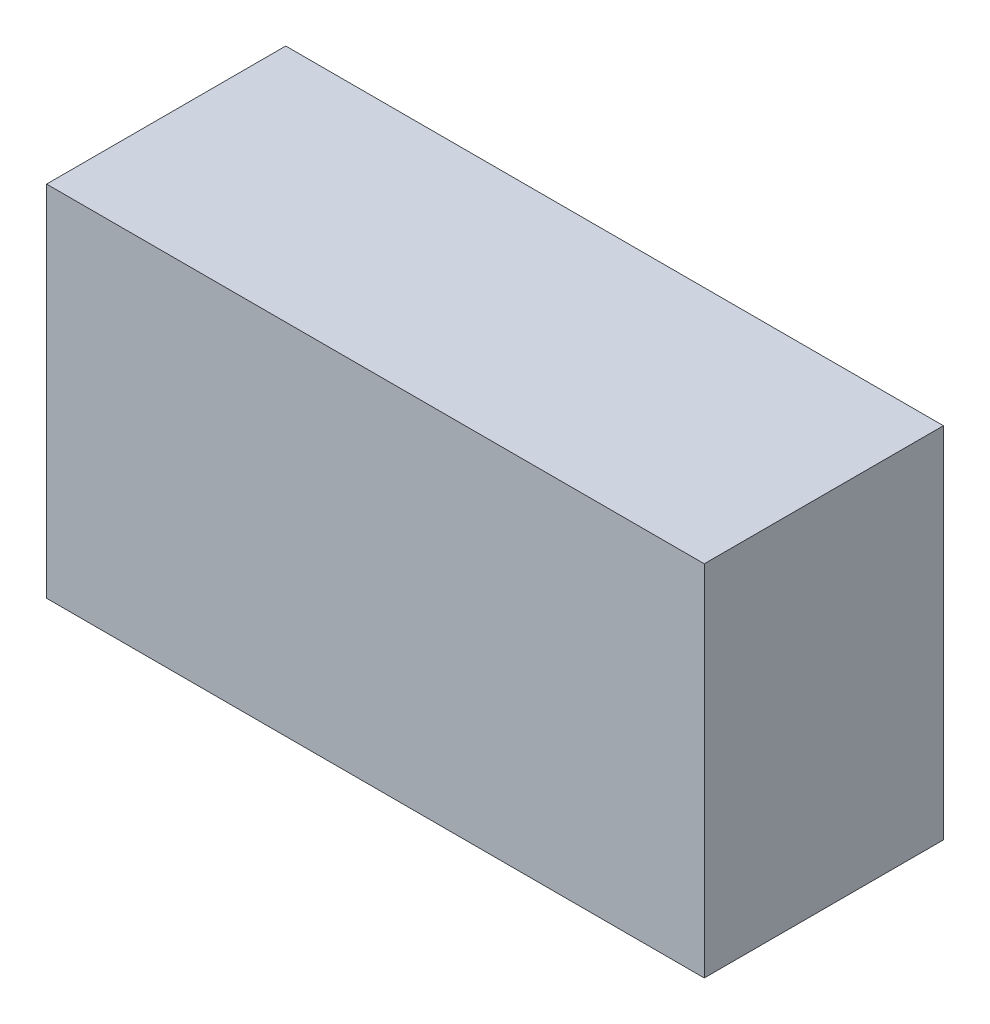
ISO-10303-21;
HEADER;
FILE_DESCRIPTION(('STEP AP214'),'2;1');
FILE_NAME('part.step','',(''),(''),'','','');
FILE_SCHEMA(('AUTOMOTIVE_DESIGN { 1 0 10303 214 1 1 1 1 }'));
ENDSEC;
DATA;
#1=APPLICATION_CONTEXT('core data for automotive mechanical design processes');
#2=APPLICATION_PROTOCOL_DEFINITION('international standard','automotive_design',2000,#1);
#3=PRODUCT_CONTEXT('',#1,'mechanical');
#4=PRODUCT('Part','Part','',(#3));
#5=PRODUCT_RELATED_PRODUCT_CATEGORY('part','',(#4));
#6=PRODUCT_DEFINITION_FORMATION('','',#4);
#7=PRODUCT_DEFINITION_CONTEXT('part definition',#1,'design');
#8=PRODUCT_DEFINITION('design','',#6,#7);
#9=PRODUCT_DEFINITION_SHAPE('','',#8);
#10=(LENGTH_UNIT() NAMED_UNIT(*) SI_UNIT(.MILLI.,.METRE.));
#11=(NAMED_UNIT(*) PLANE_ANGLE_UNIT() SI_UNIT($,.RADIAN.));
#12=(NAMED_UNIT(*) SI_UNIT($,.STERADIAN.) SOLID_ANGLE_UNIT());
#13=UNCERTAINTY_MEASURE_WITH_UNIT(LENGTH_MEASURE(1.E-05),#10,'distance_accuracy_value','');
#14=(GEOMETRIC_REPRESENTATION_CONTEXT(3) GLOBAL_UNCERTAINTY_ASSIGNED_CONTEXT((#13)) GLOBAL_UNIT_ASSIGNED_CONTEXT((#10,
#11,#12)) REPRESENTATION_CONTEXT('',''));
#15=CARTESIAN_POINT('',(0.,0.,0.));
#16=DIRECTION('',(0.,0.,1.));
#17=DIRECTION('',(1.,0.,0.));
#18=AXIS2_PLACEMENT_3D('',#15,#16,#17);
#19=CARTESIAN_POINT('',(0.,0.,12.));
#20=DIRECTION('',(1.,0.,0.));
#21=DIRECTION('',(0.,0.,-1.));
#22=AXIS2_PLACEMENT_3D('',#19,#20,#21);
#23=PLANE('',#22);
#24=DIRECTION('',(0.,-1.,0.));
#25=VECTOR('',#24,1.);
#26=CARTESIAN_POINT('',(0.,0.,0.));
#27=LINE('',#26,#25);
#28=CARTESIAN_POINT('',(0.,18.,0.));
#29=VERTEX_POINT('',#28);
#30=CARTESIAN_POINT('',(0.,0.,0.));
#31=VERTEX_POINT('',#30);
#32=EDGE_CURVE('E154',#29,#31,#27,.T.);
#33=ORIENTED_EDGE('',*,*,#32,.T.);
#34=DIRECTION('',(0.,0.,-1.));
#35=VECTOR('',#34,1.);
#36=CARTESIAN_POINT('',(0.,0.,12.));
#37=LINE('',#36,#35);
#38=CARTESIAN_POINT('',(0.,0.,12.));
#39=VERTEX_POINT('',#38);
#40=EDGE_CURVE('E11',#39,#31,#37,.T.);
#41=ORIENTED_EDGE('',*,*,#40,.F.);
#42=DIRECTION('',(0.,-1.,0.));
#43=VECTOR('',#42,1.);
#44=CARTESIAN_POINT('',(0.,0.,12.));
#45=LINE('',#44,#43);
#46=CARTESIAN_POINT('',(0.,18.,12.));
#47=VERTEX_POINT('',#46);
#48=EDGE_CURVE('E163',#47,#39,#45,.T.);
#49=ORIENTED_EDGE('',*,*,#48,.F.);
#50=DIRECTION('',(0.,0.,-1.));
#51=VECTOR('',#50,1.);
#52=CARTESIAN_POINT('',(0.,18.,12.));
#53=LINE('',#52,#51);
#54=EDGE_CURVE('E172',#47,#29,#53,.T.);
#55=ORIENTED_EDGE('',*,*,#54,.T.);
#56=EDGE_LOOP('',(#33,#41,#49,#55));
#57=FACE_BOUND('',#56,.T.);
#58=CARTESIAN_POINT('',(0.,5.81000000000001,2.70000000000003));
#59=DIRECTION('',(-1.,0.,0.));
#60=DIRECTION('',(0.,0.,1.));
#61=AXIS2_PLACEMENT_3D('',#58,#59,#60);
#62=CIRCLE('',#61,1.28);
#63=CARTESIAN_POINT('',(0.,5.81,1.42000000000003));
#64=VERTEX_POINT('',#63);
#65=CARTESIAN_POINT('',(0.,4.53,2.7));
#66=VERTEX_POINT('',#65);
#67=EDGE_CURVE('E153',#64,#66,#62,.T.);
#68=ORIENTED_EDGE('',*,*,#67,.F.);
#69=DIRECTION('',(0.,-1.,0.));
#70=VECTOR('',#69,1.);
#71=CARTESIAN_POINT('',(0.,12.19,1.42000000000003));
#72=LINE('',#71,#70);
#73=CARTESIAN_POINT('',(0.,12.19,1.42000000000003));
#74=VERTEX_POINT('',#73);
#75=EDGE_CURVE('E150',#74,#64,#72,.T.);
#76=ORIENTED_EDGE('',*,*,#75,.F.);
#77=CARTESIAN_POINT('',(0.,12.19,2.70000000000003));
#78=DIRECTION('',(-1.,0.,0.));
#79=DIRECTION('',(0.,0.,1.));
#80=AXIS2_PLACEMENT_3D('',#77,#78,#79);
#81=CIRCLE('',#80,1.28);
#82=CARTESIAN_POINT('',(0.,13.47,2.7));
#83=VERTEX_POINT('',#82);
#84=EDGE_CURVE('E340',#83,#74,#81,.T.);
#85=ORIENTED_EDGE('',*,*,#84,.F.);
#86=DIRECTION('',(0.,0.,-1.));
#87=VECTOR('',#86,1.);
#88=CARTESIAN_POINT('',(0.,13.47,3.30000000000001));
#89=LINE('',#88,#87);
#90=CARTESIAN_POINT('',(0.,13.47,3.30000000000001));
#91=VERTEX_POINT('',#90);
#92=EDGE_CURVE('E371',#91,#83,#89,.T.);
#93=ORIENTED_EDGE('',*,*,#92,.F.);
#94=CARTESIAN_POINT('',(0.,12.19,3.30000000000005));
#95=DIRECTION('',(-1.,0.,0.));
#96=DIRECTION('',(0.,0.,1.));
#97=AXIS2_PLACEMENT_3D('',#94,#95,#96);
#98=CIRCLE('',#97,1.28);
#99=CARTESIAN_POINT('',(0.,12.19,4.58000000000004));
#100=VERTEX_POINT('',#99);
#101=EDGE_CURVE('E364',#100,#91,#98,.T.);
#102=ORIENTED_EDGE('',*,*,#101,.F.);
#103=DIRECTION('',(0.,1.,0.));
#104=VECTOR('',#103,1.);
#105=CARTESIAN_POINT('',(0.,5.81,4.58000000000004));
#106=LINE('',#105,#104);
#107=CARTESIAN_POINT('',(0.,5.81,4.58000000000004));
#108=VERTEX_POINT('',#107);
#109=EDGE_CURVE('E361',#108,#100,#106,.T.);
#110=ORIENTED_EDGE('',*,*,#109,.F.);
#111=CARTESIAN_POINT('',(0.,5.81,3.30000000000004));
#112=DIRECTION('',(-1.,0.,0.));
#113=DIRECTION('',(0.,0.,1.));
#114=AXIS2_PLACEMENT_3D('',#111,#112,#113);
#115=CIRCLE('',#114,1.28);
#116=CARTESIAN_POINT('',(0.,4.53,3.3));
#117=VERTEX_POINT('',#116);
#118=EDGE_CURVE('E64',#117,#108,#115,.T.);
#119=ORIENTED_EDGE('',*,*,#118,.F.);
#120=DIRECTION('',(0.,0.,1.));
#121=VECTOR('',#120,1.);
#122=CARTESIAN_POINT('',(0.,4.53,2.7));
#123=LINE('',#122,#121);
#124=EDGE_CURVE('E59',#66,#117,#123,.T.);
#125=ORIENTED_EDGE('',*,*,#124,.F.);
#126=EDGE_LOOP('',(#68,#76,#85,#93,#102,#110,#119,#125));
#127=FACE_BOUND('',#126,.T.);
#128=ADVANCED_FACE('F45',(#57,#127),#23,.F.);
#129=CARTESIAN_POINT('',(0.,0.,12.));
#130=DIRECTION('',(0.,1.,0.));
#131=DIRECTION('',(0.,0.,1.));
#132=AXIS2_PLACEMENT_3D('',#129,#130,#131);
#133=PLANE('',#132);
#134=DIRECTION('',(1.,0.,0.));
#135=VECTOR('',#134,1.);
#136=CARTESIAN_POINT('',(0.,0.,0.));
#137=LINE('',#136,#135);
#138=CARTESIAN_POINT('',(33.,0.,0.));
#139=VERTEX_POINT('',#138);
#140=EDGE_CURVE('E157',#31,#139,#137,.T.);
#141=ORIENTED_EDGE('',*,*,#140,.T.);
#142=DIRECTION('',(0.,0.,-1.));
#143=VECTOR('',#142,1.);
#144=CARTESIAN_POINT('',(33.,0.,12.));
#145=LINE('',#144,#143);
#146=CARTESIAN_POINT('',(33.,0.,12.));
#147=VERTEX_POINT('',#146);
#148=EDGE_CURVE('E52',#147,#139,#145,.T.);
#149=ORIENTED_EDGE('',*,*,#148,.F.);
#150=DIRECTION('',(1.,0.,0.));
#151=VECTOR('',#150,1.);
#152=CARTESIAN_POINT('',(0.,0.,12.));
#153=LINE('',#152,#151);
#154=EDGE_CURVE('E166',#39,#147,#153,.T.);
#155=ORIENTED_EDGE('',*,*,#154,.F.);
#156=ORIENTED_EDGE('',*,*,#40,.T.);
#157=EDGE_LOOP('',(#141,#149,#155,#156));
#158=FACE_BOUND('',#157,.T.);
#159=ADVANCED_FACE('F203',(#158),#133,.F.);
#160=CARTESIAN_POINT('',(33.,0.,12.));
#161=DIRECTION('',(-1.,0.,0.));
#162=DIRECTION('',(0.,0.,1.));
#163=AXIS2_PLACEMENT_3D('',#160,#161,#162);
#164=PLANE('',#163);
#165=DIRECTION('',(0.,1.,0.));
#166=VECTOR('',#165,1.);
#167=CARTESIAN_POINT('',(33.,0.,0.));
#168=LINE('',#167,#166);
#169=CARTESIAN_POINT('',(33.,18.,0.));
#170=VERTEX_POINT('',#169);
#171=EDGE_CURVE('E175',#139,#170,#168,.T.);
#172=ORIENTED_EDGE('',*,*,#171,.T.);
#173=DIRECTION('',(0.,0.,-1.));
#174=VECTOR('',#173,1.);
#175=CARTESIAN_POINT('',(33.,18.,12.));
#176=LINE('',#175,#174);
#177=CARTESIAN_POINT('',(33.,18.,12.));
#178=VERTEX_POINT('',#177);
#179=EDGE_CURVE('E180',#178,#170,#176,.T.);
#180=ORIENTED_EDGE('',*,*,#179,.F.);
#181=DIRECTION('',(0.,1.,0.));
#182=VECTOR('',#181,1.);
#183=CARTESIAN_POINT('',(33.,0.,12.));
#184=LINE('',#183,#182);
#185=EDGE_CURVE('E169',#147,#178,#184,.T.);
#186=ORIENTED_EDGE('',*,*,#185,.F.);
#187=ORIENTED_EDGE('',*,*,#148,.T.);
#188=EDGE_LOOP('',(#172,#180,#186,#187));
#189=FACE_BOUND('',#188,.T.);
#190=ADVANCED_FACE('F187',(#189),#164,.F.);
#191=CARTESIAN_POINT('',(0.,18.,12.));
#192=DIRECTION('',(0.,-1.,0.));
#193=DIRECTION('',(0.,0.,-1.));
#194=AXIS2_PLACEMENT_3D('',#191,#192,#193);
#195=PLANE('',#194);
#196=DIRECTION('',(-1.,0.,0.));
#197=VECTOR('',#196,1.);
#198=CARTESIAN_POINT('',(0.,18.,0.));
#199=LINE('',#198,#197);
#200=EDGE_CURVE('E167',#170,#29,#199,.T.);
#201=ORIENTED_EDGE('',*,*,#200,.T.);
#202=ORIENTED_EDGE('',*,*,#54,.F.);
#203=DIRECTION('',(-1.,0.,0.));
#204=VECTOR('',#203,1.);
#205=CARTESIAN_POINT('',(0.,18.,12.));
#206=LINE('',#205,#204);
#207=EDGE_CURVE('E171',#178,#47,#206,.T.);
#208=ORIENTED_EDGE('',*,*,#207,.F.);
#209=ORIENTED_EDGE('',*,*,#179,.T.);
#210=EDGE_LOOP('',(#201,#202,#208,#209));
#211=FACE_BOUND('',#210,.T.);
#212=ADVANCED_FACE('F196',(#211),#195,.F.);
#213=CARTESIAN_POINT('',(0.,0.,12.));
#214=DIRECTION('',(0.,0.,-1.));
#215=DIRECTION('',(-1.,0.,0.));
#216=AXIS2_PLACEMENT_3D('',#213,#214,#215);
#217=PLANE('',#216);
#218=ORIENTED_EDGE('',*,*,#48,.T.);
#219=ORIENTED_EDGE('',*,*,#154,.T.);
#220=ORIENTED_EDGE('',*,*,#185,.T.);
#221=ORIENTED_EDGE('',*,*,#207,.T.);
#222=EDGE_LOOP('',(#218,#219,#220,#221));
#223=FACE_BOUND('',#222,.T.);
#224=ADVANCED_FACE('F202',(#223),#217,.F.);
#225=CARTESIAN_POINT('',(0.,0.,0.));
#226=DIRECTION('',(0.,0.,-1.));
#227=DIRECTION('',(-1.,0.,0.));
#228=AXIS2_PLACEMENT_3D('',#225,#226,#227);
#229=PLANE('',#228);
#230=ORIENTED_EDGE('',*,*,#32,.F.);
#231=ORIENTED_EDGE('',*,*,#200,.F.);
#232=ORIENTED_EDGE('',*,*,#171,.F.);
#233=ORIENTED_EDGE('',*,*,#140,.F.);
#234=EDGE_LOOP('',(#230,#231,#232,#233));
#235=FACE_BOUND('',#234,.T.);
#236=ADVANCED_FACE('F193',(#235),#229,.T.);
#237=CARTESIAN_POINT('',(-2.,5.81000000000001,2.70000000000003));
#238=DIRECTION('',(1.,0.,0.));
#239=DIRECTION('',(0.,0.,-1.));
#240=AXIS2_PLACEMENT_3D('',#237,#238,#239);
#241=CYLINDRICAL_SURFACE('',#240,1.28);
#242=ORIENTED_EDGE('',*,*,#67,.T.);
#243=DIRECTION('',(1.,0.,0.));
#244=VECTOR('',#243,1.);
#245=CARTESIAN_POINT('',(-2.,4.53,2.7));
#246=LINE('',#245,#244);
#247=CARTESIAN_POINT('',(-2.,4.53,2.7));
#248=VERTEX_POINT('',#247);
#249=EDGE_CURVE('E134',#248,#66,#246,.T.);
#250=ORIENTED_EDGE('',*,*,#249,.F.);
#251=CARTESIAN_POINT('',(-2.,5.81000000000001,2.70000000000003));
#252=DIRECTION('',(-1.,0.,0.));
#253=DIRECTION('',(0.,0.,1.));
#254=AXIS2_PLACEMENT_3D('',#251,#252,#253);
#255=CIRCLE('',#254,1.28);
#256=CARTESIAN_POINT('',(-2.,5.81,1.42000000000003));
#257=VERTEX_POINT('',#256);
#258=EDGE_CURVE('E141',#257,#248,#255,.T.);
#259=ORIENTED_EDGE('',*,*,#258,.F.);
#260=DIRECTION('',(1.,0.,0.));
#261=VECTOR('',#260,1.);
#262=CARTESIAN_POINT('',(-2.,5.81,1.42000000000003));
#263=LINE('',#262,#261);
#264=EDGE_CURVE('E336',#257,#64,#263,.T.);
#265=ORIENTED_EDGE('',*,*,#264,.T.);
#266=EDGE_LOOP('',(#242,#250,#259,#265));
#267=FACE_BOUND('',#266,.T.);
#268=ADVANCED_FACE('F152',(#267),#241,.T.);
#269=CARTESIAN_POINT('',(-2.,4.53,2.7));
#270=DIRECTION('',(0.,1.,0.));
#271=DIRECTION('',(0.,0.,1.));
#272=AXIS2_PLACEMENT_3D('',#269,#270,#271);
#273=PLANE('',#272);
#274=ORIENTED_EDGE('',*,*,#124,.T.);
#275=DIRECTION('',(1.,0.,0.));
#276=VECTOR('',#275,1.);
#277=CARTESIAN_POINT('',(-2.,4.53,3.3));
#278=LINE('',#277,#276);
#279=CARTESIAN_POINT('',(-2.,4.53,3.3));
#280=VERTEX_POINT('',#279);
#281=EDGE_CURVE('E137',#280,#117,#278,.T.);
#282=ORIENTED_EDGE('',*,*,#281,.F.);
#283=DIRECTION('',(0.,0.,1.));
#284=VECTOR('',#283,1.);
#285=CARTESIAN_POINT('',(-2.,4.53,2.7));
#286=LINE('',#285,#284);
#287=EDGE_CURVE('E130',#248,#280,#286,.T.);
#288=ORIENTED_EDGE('',*,*,#287,.F.);
#289=ORIENTED_EDGE('',*,*,#249,.T.);
#290=EDGE_LOOP('',(#274,#282,#288,#289));
#291=FACE_BOUND('',#290,.T.);
#292=ADVANCED_FACE('F132',(#291),#273,.F.);
#293=CARTESIAN_POINT('',(-2.,5.81,3.30000000000004));
#294=DIRECTION('',(1.,0.,0.));
#295=DIRECTION('',(0.,0.,-1.));
#296=AXIS2_PLACEMENT_3D('',#293,#294,#295);
#297=CYLINDRICAL_SURFACE('',#296,1.28);
#298=ORIENTED_EDGE('',*,*,#118,.T.);
#299=DIRECTION('',(1.,0.,0.));
#300=VECTOR('',#299,1.);
#301=CARTESIAN_POINT('',(-2.,5.81,4.58000000000004));
#302=LINE('',#301,#300);
#303=CARTESIAN_POINT('',(-2.,5.81,4.58000000000004));
#304=VERTEX_POINT('',#303);
#305=EDGE_CURVE('E159',#304,#108,#302,.T.);
#306=ORIENTED_EDGE('',*,*,#305,.F.);
#307=CARTESIAN_POINT('',(-2.,5.81,3.30000000000004));
#308=DIRECTION('',(-1.,0.,0.));
#309=DIRECTION('',(0.,0.,1.));
#310=AXIS2_PLACEMENT_3D('',#307,#308,#309);
#311=CIRCLE('',#310,1.28);
#312=EDGE_CURVE('E140',#280,#304,#311,.T.);
#313=ORIENTED_EDGE('',*,*,#312,.F.);
#314=ORIENTED_EDGE('',*,*,#281,.T.);
#315=EDGE_LOOP('',(#298,#306,#313,#314));
#316=FACE_BOUND('',#315,.T.);
#317=ADVANCED_FACE('F221',(#316),#297,.T.);
#318=CARTESIAN_POINT('',(-2.,5.81,4.58000000000004));
#319=DIRECTION('',(0.,0.,-1.));
#320=DIRECTION('',(0.,1.,0.));
#321=AXIS2_PLACEMENT_3D('',#318,#319,#320);
#322=PLANE('',#321);
#323=ORIENTED_EDGE('',*,*,#109,.T.);
#324=DIRECTION('',(1.,0.,0.));
#325=VECTOR('',#324,1.);
#326=CARTESIAN_POINT('',(-2.,12.19,4.58000000000004));
#327=LINE('',#326,#325);
#328=CARTESIAN_POINT('',(-2.,12.19,4.58000000000004));
#329=VERTEX_POINT('',#328);
#330=EDGE_CURVE('E354',#329,#100,#327,.T.);
#331=ORIENTED_EDGE('',*,*,#330,.F.);
#332=DIRECTION('',(0.,1.,0.));
#333=VECTOR('',#332,1.);
#334=CARTESIAN_POINT('',(-2.,5.81,4.58000000000004));
#335=LINE('',#334,#333);
#336=EDGE_CURVE('E362',#304,#329,#335,.T.);
#337=ORIENTED_EDGE('',*,*,#336,.F.);
#338=ORIENTED_EDGE('',*,*,#305,.T.);
#339=EDGE_LOOP('',(#323,#331,#337,#338));
#340=FACE_BOUND('',#339,.T.);
#341=ADVANCED_FACE('F224',(#340),#322,.F.);
#342=CARTESIAN_POINT('',(-2.,12.19,3.30000000000005));
#343=DIRECTION('',(1.,0.,0.));
#344=DIRECTION('',(0.,0.,-1.));
#345=AXIS2_PLACEMENT_3D('',#342,#343,#344);
#346=CYLINDRICAL_SURFACE('',#345,1.28);
#347=ORIENTED_EDGE('',*,*,#101,.T.);
#348=DIRECTION('',(1.,0.,0.));
#349=VECTOR('',#348,1.);
#350=CARTESIAN_POINT('',(-2.,13.47,3.3));
#351=LINE('',#350,#349);
#352=CARTESIAN_POINT('',(-2.,13.47,3.3));
#353=VERTEX_POINT('',#352);
#354=EDGE_CURVE('E351',#353,#91,#351,.T.);
#355=ORIENTED_EDGE('',*,*,#354,.F.);
#356=CARTESIAN_POINT('',(-2.,12.19,3.30000000000005));
#357=DIRECTION('',(-1.,0.,0.));
#358=DIRECTION('',(0.,0.,1.));
#359=AXIS2_PLACEMENT_3D('',#356,#357,#358);
#360=CIRCLE('',#359,1.28);
#361=EDGE_CURVE('E379',#329,#353,#360,.T.);
#362=ORIENTED_EDGE('',*,*,#361,.F.);
#363=ORIENTED_EDGE('',*,*,#330,.T.);
#364=EDGE_LOOP('',(#347,#355,#362,#363));
#365=FACE_BOUND('',#364,.T.);
#366=ADVANCED_FACE('F228',(#365),#346,.T.);
#367=CARTESIAN_POINT('',(-2.,13.47,3.30000000000001));
#368=DIRECTION('',(0.,-1.,0.));
#369=DIRECTION('',(0.,0.,-1.));
#370=AXIS2_PLACEMENT_3D('',#367,#368,#369);
#371=PLANE('',#370);
#372=ORIENTED_EDGE('',*,*,#92,.T.);
#373=DIRECTION('',(1.,0.,0.));
#374=VECTOR('',#373,1.);
#375=CARTESIAN_POINT('',(-2.,13.47,2.7));
#376=LINE('',#375,#374);
#377=CARTESIAN_POINT('',(-2.,13.47,2.7));
#378=VERTEX_POINT('',#377);
#379=EDGE_CURVE('E343',#378,#83,#376,.T.);
#380=ORIENTED_EDGE('',*,*,#379,.F.);
#381=DIRECTION('',(0.,0.,-1.));
#382=VECTOR('',#381,1.);
#383=CARTESIAN_POINT('',(-2.,13.47,3.30000000000001));
#384=LINE('',#383,#382);
#385=EDGE_CURVE('E377',#353,#378,#384,.T.);
#386=ORIENTED_EDGE('',*,*,#385,.F.);
#387=ORIENTED_EDGE('',*,*,#354,.T.);
#388=EDGE_LOOP('',(#372,#380,#386,#387));
#389=FACE_BOUND('',#388,.T.);
#390=ADVANCED_FACE('F232',(#389),#371,.F.);
#391=CARTESIAN_POINT('',(-2.,12.19,2.70000000000003));
#392=DIRECTION('',(1.,0.,0.));
#393=DIRECTION('',(0.,0.,-1.));
#394=AXIS2_PLACEMENT_3D('',#391,#392,#393);
#395=CYLINDRICAL_SURFACE('',#394,1.28);
#396=ORIENTED_EDGE('',*,*,#84,.T.);
#397=DIRECTION('',(1.,0.,0.));
#398=VECTOR('',#397,1.);
#399=CARTESIAN_POINT('',(-2.,12.19,1.42000000000003));
#400=LINE('',#399,#398);
#401=CARTESIAN_POINT('',(-2.,12.19,1.42000000000003));
#402=VERTEX_POINT('',#401);
#403=EDGE_CURVE('E338',#402,#74,#400,.T.);
#404=ORIENTED_EDGE('',*,*,#403,.F.);
#405=CARTESIAN_POINT('',(-2.,12.19,2.70000000000003));
#406=DIRECTION('',(-1.,0.,0.));
#407=DIRECTION('',(0.,0.,1.));
#408=AXIS2_PLACEMENT_3D('',#405,#406,#407);
#409=CIRCLE('',#408,1.28);
#410=EDGE_CURVE('E345',#378,#402,#409,.T.);
#411=ORIENTED_EDGE('',*,*,#410,.F.);
#412=ORIENTED_EDGE('',*,*,#379,.T.);
#413=EDGE_LOOP('',(#396,#404,#411,#412));
#414=FACE_BOUND('',#413,.T.);
#415=ADVANCED_FACE('F236',(#414),#395,.T.);
#416=CARTESIAN_POINT('',(-2.,12.19,1.42000000000003));
#417=DIRECTION('',(0.,0.,1.));
#418=DIRECTION('',(0.,-1.,0.));
#419=AXIS2_PLACEMENT_3D('',#416,#417,#418);
#420=PLANE('',#419);
#421=ORIENTED_EDGE('',*,*,#75,.T.);
#422=ORIENTED_EDGE('',*,*,#264,.F.);
#423=DIRECTION('',(0.,-1.,0.));
#424=VECTOR('',#423,1.);
#425=CARTESIAN_POINT('',(-2.,12.19,1.42000000000003));
#426=LINE('',#425,#424);
#427=EDGE_CURVE('E146',#402,#257,#426,.T.);
#428=ORIENTED_EDGE('',*,*,#427,.F.);
#429=ORIENTED_EDGE('',*,*,#403,.T.);
#430=EDGE_LOOP('',(#421,#422,#428,#429));
#431=FACE_BOUND('',#430,.T.);
#432=ADVANCED_FACE('F240',(#431),#420,.F.);
#433=CARTESIAN_POINT('',(-2.,5.81000000000001,2.70000000000003));
#434=DIRECTION('',(-1.,0.,0.));
#435=DIRECTION('',(0.,0.,1.));
#436=AXIS2_PLACEMENT_3D('',#433,#434,#435);
#437=PLANE('',#436);
#438=ORIENTED_EDGE('',*,*,#258,.T.);
#439=ORIENTED_EDGE('',*,*,#287,.T.);
#440=ORIENTED_EDGE('',*,*,#312,.T.);
#441=ORIENTED_EDGE('',*,*,#336,.T.);
#442=ORIENTED_EDGE('',*,*,#361,.T.);
#443=ORIENTED_EDGE('',*,*,#385,.T.);
#444=ORIENTED_EDGE('',*,*,#410,.T.);
#445=ORIENTED_EDGE('',*,*,#427,.T.);
#446=EDGE_LOOP('',(#438,#439,#440,#441,#442,#443,#444,#445));
#447=FACE_BOUND('',#446,.T.);
#448=ADVANCED_FACE('F144',(#447),#437,.T.);
#449=CLOSED_SHELL('',(#128,#159,#190,#212,#224,#236,#268,#292,#317,#341,#366,#390,#415,#432,#448));
#450=MANIFOLD_SOLID_BREP('B2',#449);
#451=ADVANCED_BREP_SHAPE_REPRESENTATION('',(#18,#450),#14);
#452=SHAPE_DEFINITION_REPRESENTATION(#9,#451);
ENDSEC;
END-ISO-10303-21;
